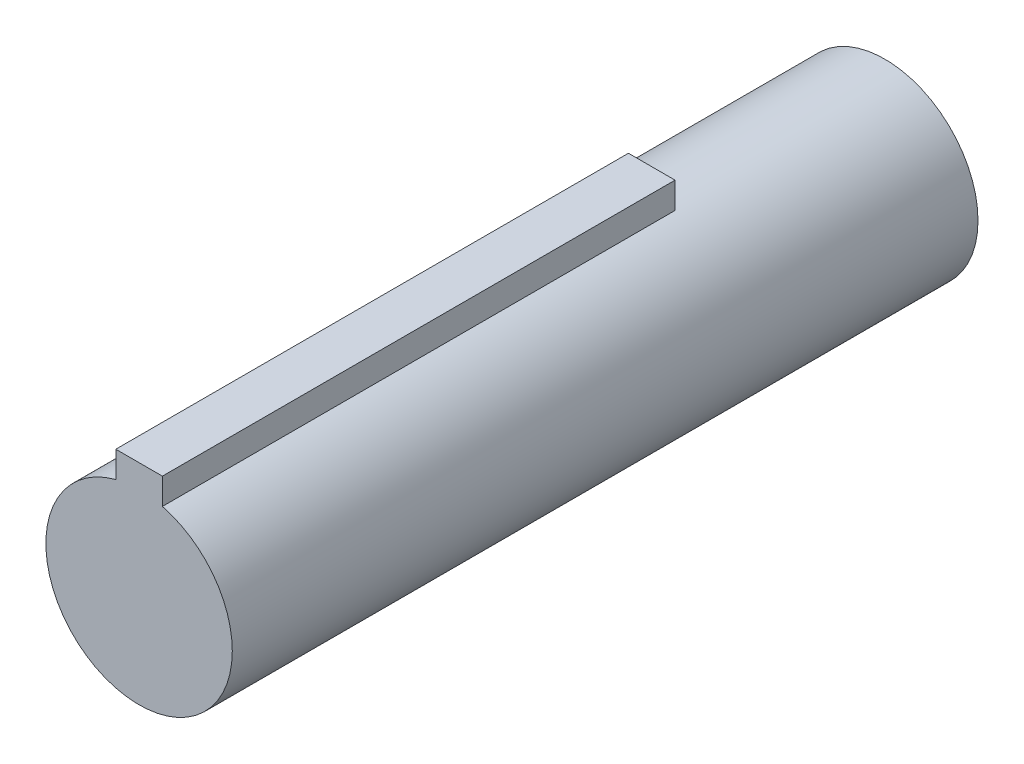
ISO-10303-21;
HEADER;
FILE_DESCRIPTION(('STEP AP214'),'2;1');
FILE_NAME('part.step','',(''),(''),'','','');
FILE_SCHEMA(('AUTOMOTIVE_DESIGN { 1 0 10303 214 1 1 1 1 }'));
ENDSEC;
DATA;
#1=APPLICATION_CONTEXT('core data for automotive mechanical design processes');
#2=APPLICATION_PROTOCOL_DEFINITION('international standard','automotive_design',2000,#1);
#3=PRODUCT_CONTEXT('',#1,'mechanical');
#4=PRODUCT('Part','Part','',(#3));
#5=PRODUCT_RELATED_PRODUCT_CATEGORY('part','',(#4));
#6=PRODUCT_DEFINITION_FORMATION('','',#4);
#7=PRODUCT_DEFINITION_CONTEXT('part definition',#1,'design');
#8=PRODUCT_DEFINITION('design','',#6,#7);
#9=PRODUCT_DEFINITION_SHAPE('','',#8);
#10=(LENGTH_UNIT() NAMED_UNIT(*) SI_UNIT(.MILLI.,.METRE.));
#11=(NAMED_UNIT(*) PLANE_ANGLE_UNIT() SI_UNIT($,.RADIAN.));
#12=(NAMED_UNIT(*) SI_UNIT($,.STERADIAN.) SOLID_ANGLE_UNIT());
#13=UNCERTAINTY_MEASURE_WITH_UNIT(LENGTH_MEASURE(1.E-05),#10,'distance_accuracy_value','');
#14=(GEOMETRIC_REPRESENTATION_CONTEXT(3) GLOBAL_UNCERTAINTY_ASSIGNED_CONTEXT((#13)) GLOBAL_UNIT_ASSIGNED_CONTEXT((#10,
#11,#12)) REPRESENTATION_CONTEXT('',''));
#15=CARTESIAN_POINT('',(0.,0.,0.));
#16=DIRECTION('',(0.,0.,1.));
#17=DIRECTION('',(1.,0.,0.));
#18=AXIS2_PLACEMENT_3D('',#15,#16,#17);
#19=CARTESIAN_POINT('',(5.00000000000013,24.9999999999999,-150.));
#20=DIRECTION('',(0.,1.,0.));
#21=DIRECTION('',(-1.,0.,0.));
#22=AXIS2_PLACEMENT_3D('',#19,#20,#21);
#23=PLANE('',#22);
#24=DIRECTION('',(0.,0.,1.));
#25=VECTOR('',#24,1.);
#26=CARTESIAN_POINT('',(5.00000000000013,24.9999999999999,-150.));
#27=LINE('',#26,#25);
#28=CARTESIAN_POINT('',(5.00000000000013,24.9999999999999,-100.));
#29=VERTEX_POINT('',#28);
#30=CARTESIAN_POINT('',(5.00000000000013,24.9999999999999,10.));
#31=VERTEX_POINT('',#30);
#32=EDGE_CURVE('E11',#29,#31,#27,.T.);
#33=ORIENTED_EDGE('',*,*,#32,.F.);
#34=DIRECTION('',(1.,0.,0.));
#35=VECTOR('',#34,1.);
#36=CARTESIAN_POINT('',(5.00000000000013,24.9999999999999,-100.));
#37=LINE('',#36,#35);
#38=CARTESIAN_POINT('',(-4.99999999999987,25.,-100.));
#39=VERTEX_POINT('',#38);
#40=EDGE_CURVE('E87',#39,#29,#37,.T.);
#41=ORIENTED_EDGE('',*,*,#40,.F.);
#42=DIRECTION('',(0.,0.,1.));
#43=VECTOR('',#42,1.);
#44=CARTESIAN_POINT('',(-4.99999999999987,25.,-150.));
#45=LINE('',#44,#43);
#46=CARTESIAN_POINT('',(-4.99999999999987,25.,10.));
#47=VERTEX_POINT('',#46);
#48=EDGE_CURVE('E35',#39,#47,#45,.T.);
#49=ORIENTED_EDGE('',*,*,#48,.T.);
#50=DIRECTION('',(-1.,0.,0.));
#51=VECTOR('',#50,1.);
#52=CARTESIAN_POINT('',(5.00000000000013,24.9999999999999,10.));
#53=LINE('',#52,#51);
#54=EDGE_CURVE('E102',#31,#47,#53,.T.);
#55=ORIENTED_EDGE('',*,*,#54,.F.);
#56=EDGE_LOOP('',(#33,#41,#49,#55));
#57=FACE_BOUND('',#56,.T.);
#58=ADVANCED_FACE('F32',(#57),#23,.T.);
#59=CARTESIAN_POINT('',(5.00000000000013,19.364916731037,-150.));
#60=DIRECTION('',(1.,0.,0.));
#61=DIRECTION('',(0.,0.,-1.));
#62=AXIS2_PLACEMENT_3D('',#59,#60,#61);
#63=PLANE('',#62);
#64=DIRECTION('',(0.,0.,1.));
#65=VECTOR('',#64,1.);
#66=CARTESIAN_POINT('',(5.00000000000013,19.364916731037,-150.));
#67=LINE('',#66,#65);
#68=CARTESIAN_POINT('',(5.00000000000013,19.364916731037,-100.));
#69=VERTEX_POINT('',#68);
#70=CARTESIAN_POINT('',(5.00000000000013,19.364916731037,10.));
#71=VERTEX_POINT('',#70);
#72=EDGE_CURVE('E40',#69,#71,#67,.T.);
#73=ORIENTED_EDGE('',*,*,#72,.F.);
#74=DIRECTION('',(0.,-1.,0.));
#75=VECTOR('',#74,1.);
#76=CARTESIAN_POINT('',(5.00000000000013,19.364916731037,-100.));
#77=LINE('',#76,#75);
#78=EDGE_CURVE('E78',#29,#69,#77,.T.);
#79=ORIENTED_EDGE('',*,*,#78,.F.);
#80=ORIENTED_EDGE('',*,*,#32,.T.);
#81=DIRECTION('',(0.,1.,0.));
#82=VECTOR('',#81,1.);
#83=CARTESIAN_POINT('',(5.00000000000013,19.364916731037,10.));
#84=LINE('',#83,#82);
#85=EDGE_CURVE('E97',#71,#31,#84,.T.);
#86=ORIENTED_EDGE('',*,*,#85,.F.);
#87=EDGE_LOOP('',(#73,#79,#80,#86));
#88=FACE_BOUND('',#87,.T.);
#89=ADVANCED_FACE('F107',(#88),#63,.T.);
#90=CARTESIAN_POINT('',(-4.99999999999987,25.,-150.));
#91=DIRECTION('',(-1.,0.,0.));
#92=DIRECTION('',(0.,-1.,0.));
#93=AXIS2_PLACEMENT_3D('',#90,#91,#92);
#94=PLANE('',#93);
#95=ORIENTED_EDGE('',*,*,#48,.F.);
#96=DIRECTION('',(0.,1.,0.));
#97=VECTOR('',#96,1.);
#98=CARTESIAN_POINT('',(-4.99999999999987,25.,-100.));
#99=LINE('',#98,#97);
#100=CARTESIAN_POINT('',(-4.99999999999988,19.364916731037,-100.));
#101=VERTEX_POINT('',#100);
#102=EDGE_CURVE('E76',#101,#39,#99,.T.);
#103=ORIENTED_EDGE('',*,*,#102,.F.);
#104=DIRECTION('',(0.,0.,1.));
#105=VECTOR('',#104,1.);
#106=CARTESIAN_POINT('',(-4.99999999999988,19.364916731037,-150.));
#107=LINE('',#106,#105);
#108=CARTESIAN_POINT('',(-4.99999999999988,19.364916731037,10.));
#109=VERTEX_POINT('',#108);
#110=EDGE_CURVE('E85',#101,#109,#107,.T.);
#111=ORIENTED_EDGE('',*,*,#110,.T.);
#112=DIRECTION('',(0.,-1.,0.));
#113=VECTOR('',#112,1.);
#114=CARTESIAN_POINT('',(-4.99999999999987,25.,10.));
#115=LINE('',#114,#113);
#116=EDGE_CURVE('E100',#47,#109,#115,.T.);
#117=ORIENTED_EDGE('',*,*,#116,.F.);
#118=EDGE_LOOP('',(#95,#103,#111,#117));
#119=FACE_BOUND('',#118,.T.);
#120=ADVANCED_FACE('F83',(#119),#94,.T.);
#121=CARTESIAN_POINT('',(1.11022266636837E-13,0.,-150.));
#122=DIRECTION('',(0.,0.,1.));
#123=DIRECTION('',(1.,0.,0.));
#124=AXIS2_PLACEMENT_3D('',#121,#122,#123);
#125=CYLINDRICAL_SURFACE('',#124,20.);
#126=CARTESIAN_POINT('',(1.11022266636837E-13,0.,-100.));
#127=DIRECTION('',(0.,0.,1.));
#128=DIRECTION('',(-1.,0.,0.));
#129=AXIS2_PLACEMENT_3D('',#126,#127,#128);
#130=CIRCLE('',#129,20.);
#131=EDGE_CURVE('E73',#69,#101,#130,.T.);
#132=ORIENTED_EDGE('',*,*,#131,.F.);
#133=ORIENTED_EDGE('',*,*,#72,.T.);
#134=CARTESIAN_POINT('',(1.11022266636837E-13,0.,10.));
#135=DIRECTION('',(0.,0.,1.));
#136=DIRECTION('',(1.,0.,0.));
#137=AXIS2_PLACEMENT_3D('',#134,#135,#136);
#138=CIRCLE('',#137,20.);
#139=EDGE_CURVE('E91',#109,#71,#138,.T.);
#140=ORIENTED_EDGE('',*,*,#139,.F.);
#141=ORIENTED_EDGE('',*,*,#110,.F.);
#142=EDGE_LOOP('',(#132,#133,#140,#141));
#143=FACE_BOUND('',#142,.T.);
#144=CARTESIAN_POINT('',(1.11022266636837E-13,0.,-150.));
#145=DIRECTION('',(0.,0.,1.));
#146=DIRECTION('',(1.,0.,0.));
#147=AXIS2_PLACEMENT_3D('',#144,#145,#146);
#148=CIRCLE('',#147,20.);
#149=CARTESIAN_POINT('',(20.0000000000001,0.,-150.));
#150=VERTEX_POINT('',#149);
#151=EDGE_CURVE('E93',#150,#150,#148,.T.);
#152=ORIENTED_EDGE('',*,*,#151,.T.);
#153=EDGE_LOOP('',(#152));
#154=FACE_BOUND('',#153,.T.);
#155=ADVANCED_FACE('F89',(#143,#154),#125,.T.);
#156=CARTESIAN_POINT('',(1.11022266636837E-13,0.,-150.));
#157=DIRECTION('',(0.,0.,1.));
#158=DIRECTION('',(1.,0.,0.));
#159=AXIS2_PLACEMENT_3D('',#156,#157,#158);
#160=PLANE('',#159);
#161=ORIENTED_EDGE('',*,*,#151,.F.);
#162=EDGE_LOOP('',(#161));
#163=FACE_BOUND('',#162,.T.);
#164=ADVANCED_FACE('F112',(#163),#160,.F.);
#165=CARTESIAN_POINT('',(1.11022266636837E-13,0.,10.));
#166=DIRECTION('',(0.,0.,1.));
#167=DIRECTION('',(1.,0.,0.));
#168=AXIS2_PLACEMENT_3D('',#165,#166,#167);
#169=PLANE('',#168);
#170=ORIENTED_EDGE('',*,*,#54,.T.);
#171=ORIENTED_EDGE('',*,*,#116,.T.);
#172=ORIENTED_EDGE('',*,*,#139,.T.);
#173=ORIENTED_EDGE('',*,*,#85,.T.);
#174=EDGE_LOOP('',(#170,#171,#172,#173));
#175=FACE_BOUND('',#174,.T.);
#176=ADVANCED_FACE('F110',(#175),#169,.T.);
#177=CARTESIAN_POINT('',(1.11022266636837E-13,0.,-100.));
#178=DIRECTION('',(0.,0.,-1.));
#179=DIRECTION('',(-1.,0.,0.));
#180=AXIS2_PLACEMENT_3D('',#177,#178,#179);
#181=PLANE('',#180);
#182=ORIENTED_EDGE('',*,*,#131,.T.);
#183=ORIENTED_EDGE('',*,*,#102,.T.);
#184=ORIENTED_EDGE('',*,*,#40,.T.);
#185=ORIENTED_EDGE('',*,*,#78,.T.);
#186=EDGE_LOOP('',(#182,#183,#184,#185));
#187=FACE_BOUND('',#186,.T.);
#188=ADVANCED_FACE('F75',(#187),#181,.T.);
#189=CLOSED_SHELL('',(#58,#89,#120,#155,#164,#176,#188));
#190=MANIFOLD_SOLID_BREP('B2',#189);
#191=ADVANCED_BREP_SHAPE_REPRESENTATION('',(#18,#190),#14);
#192=SHAPE_DEFINITION_REPRESENTATION(#9,#191);
ENDSEC;
END-ISO-10303-21;
